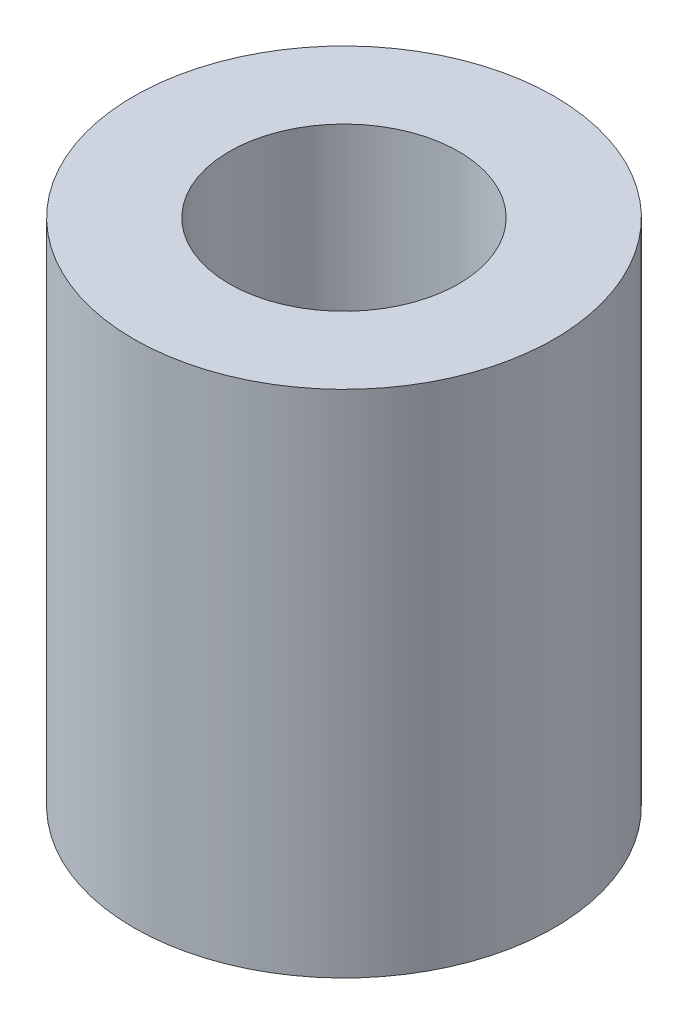
ISO-10303-21;
HEADER;
FILE_DESCRIPTION(('STEP AP214'),'2;1');
FILE_NAME('part.step','',(''),(''),'','','');
FILE_SCHEMA(('AUTOMOTIVE_DESIGN { 1 0 10303 214 1 1 1 1 }'));
ENDSEC;
DATA;
#1=APPLICATION_CONTEXT('core data for automotive mechanical design processes');
#2=APPLICATION_PROTOCOL_DEFINITION('international standard','automotive_design',2000,#1);
#3=PRODUCT_CONTEXT('',#1,'mechanical');
#4=PRODUCT('Part','Part','',(#3));
#5=PRODUCT_RELATED_PRODUCT_CATEGORY('part','',(#4));
#6=PRODUCT_DEFINITION_FORMATION('','',#4);
#7=PRODUCT_DEFINITION_CONTEXT('part definition',#1,'design');
#8=PRODUCT_DEFINITION('design','',#6,#7);
#9=PRODUCT_DEFINITION_SHAPE('','',#8);
#10=(LENGTH_UNIT() NAMED_UNIT(*) SI_UNIT(.MILLI.,.METRE.));
#11=(NAMED_UNIT(*) PLANE_ANGLE_UNIT() SI_UNIT($,.RADIAN.));
#12=(NAMED_UNIT(*) SI_UNIT($,.STERADIAN.) SOLID_ANGLE_UNIT());
#13=UNCERTAINTY_MEASURE_WITH_UNIT(LENGTH_MEASURE(1.E-05),#10,'distance_accuracy_value','');
#14=(GEOMETRIC_REPRESENTATION_CONTEXT(3) GLOBAL_UNCERTAINTY_ASSIGNED_CONTEXT((#13)) GLOBAL_UNIT_ASSIGNED_CONTEXT((#10,
#11,#12)) REPRESENTATION_CONTEXT('',''));
#15=CARTESIAN_POINT('',(0.,0.,0.));
#16=DIRECTION('',(0.,0.,1.));
#17=DIRECTION('',(1.,0.,0.));
#18=AXIS2_PLACEMENT_3D('',#15,#16,#17);
#19=CARTESIAN_POINT('',(0.,8.,0.));
#20=DIRECTION('',(0.,1.,0.));
#21=DIRECTION('',(0.,0.,1.));
#22=AXIS2_PLACEMENT_3D('',#19,#20,#21);
#23=PLANE('',#22);
#24=CARTESIAN_POINT('',(0.,8.,0.));
#25=DIRECTION('',(0.,1.,0.));
#26=DIRECTION('',(0.,0.,1.));
#27=AXIS2_PLACEMENT_3D('',#24,#25,#26);
#28=CIRCLE('',#27,3.3);
#29=CARTESIAN_POINT('',(0.,8.,3.3));
#30=VERTEX_POINT('',#29);
#31=EDGE_CURVE('E10',#30,#30,#28,.T.);
#32=ORIENTED_EDGE('',*,*,#31,.T.);
#33=EDGE_LOOP('',(#32));
#34=FACE_BOUND('',#33,.T.);
#35=CARTESIAN_POINT('',(0.,8.,0.));
#36=DIRECTION('',(0.,1.,0.));
#37=DIRECTION('',(0.,0.,1.));
#38=AXIS2_PLACEMENT_3D('',#35,#36,#37);
#39=CIRCLE('',#38,1.8);
#40=CARTESIAN_POINT('',(0.,8.,1.8));
#41=VERTEX_POINT('',#40);
#42=EDGE_CURVE('E42',#41,#41,#39,.T.);
#43=ORIENTED_EDGE('',*,*,#42,.F.);
#44=EDGE_LOOP('',(#43));
#45=FACE_BOUND('',#44,.T.);
#46=ADVANCED_FACE('F31',(#34,#45),#23,.T.);
#47=CARTESIAN_POINT('',(0.,0.,0.));
#48=DIRECTION('',(0.,1.,0.));
#49=DIRECTION('',(0.,0.,1.));
#50=AXIS2_PLACEMENT_3D('',#47,#48,#49);
#51=PLANE('',#50);
#52=CARTESIAN_POINT('',(0.,0.,0.));
#53=DIRECTION('',(0.,1.,0.));
#54=DIRECTION('',(0.,0.,1.));
#55=AXIS2_PLACEMENT_3D('',#52,#53,#54);
#56=CIRCLE('',#55,3.3);
#57=CARTESIAN_POINT('',(0.,0.,3.3));
#58=VERTEX_POINT('',#57);
#59=EDGE_CURVE('E35',#58,#58,#56,.T.);
#60=ORIENTED_EDGE('',*,*,#59,.F.);
#61=EDGE_LOOP('',(#60));
#62=FACE_BOUND('',#61,.T.);
#63=CARTESIAN_POINT('',(0.,0.,0.));
#64=DIRECTION('',(0.,1.,0.));
#65=DIRECTION('',(0.,0.,1.));
#66=AXIS2_PLACEMENT_3D('',#63,#64,#65);
#67=CIRCLE('',#66,1.8);
#68=CARTESIAN_POINT('',(0.,0.,1.8));
#69=VERTEX_POINT('',#68);
#70=EDGE_CURVE('E44',#69,#69,#67,.T.);
#71=ORIENTED_EDGE('',*,*,#70,.T.);
#72=EDGE_LOOP('',(#71));
#73=FACE_BOUND('',#72,.T.);
#74=ADVANCED_FACE('F54',(#62,#73),#51,.F.);
#75=CARTESIAN_POINT('',(0.,8.,0.));
#76=DIRECTION('',(0.,-1.,0.));
#77=DIRECTION('',(0.,0.,-1.));
#78=AXIS2_PLACEMENT_3D('',#75,#76,#77);
#79=CYLINDRICAL_SURFACE('',#78,3.3);
#80=ORIENTED_EDGE('',*,*,#31,.F.);
#81=EDGE_LOOP('',(#80));
#82=FACE_BOUND('',#81,.T.);
#83=ORIENTED_EDGE('',*,*,#59,.T.);
#84=EDGE_LOOP('',(#83));
#85=FACE_BOUND('',#84,.T.);
#86=ADVANCED_FACE('F33',(#82,#85),#79,.T.);
#87=CARTESIAN_POINT('',(0.,8.,0.));
#88=DIRECTION('',(0.,-1.,0.));
#89=DIRECTION('',(0.,0.,-1.));
#90=AXIS2_PLACEMENT_3D('',#87,#88,#89);
#91=CYLINDRICAL_SURFACE('',#90,1.8);
#92=ORIENTED_EDGE('',*,*,#42,.T.);
#93=EDGE_LOOP('',(#92));
#94=FACE_BOUND('',#93,.T.);
#95=ORIENTED_EDGE('',*,*,#70,.F.);
#96=EDGE_LOOP('',(#95));
#97=FACE_BOUND('',#96,.T.);
#98=ADVANCED_FACE('F50',(#94,#97),#91,.F.);
#99=CLOSED_SHELL('',(#46,#74,#86,#98));
#100=MANIFOLD_SOLID_BREP('B2',#99);
#101=ADVANCED_BREP_SHAPE_REPRESENTATION('',(#18,#100),#14);
#102=SHAPE_DEFINITION_REPRESENTATION(#9,#101);
ENDSEC;
END-ISO-10303-21;
